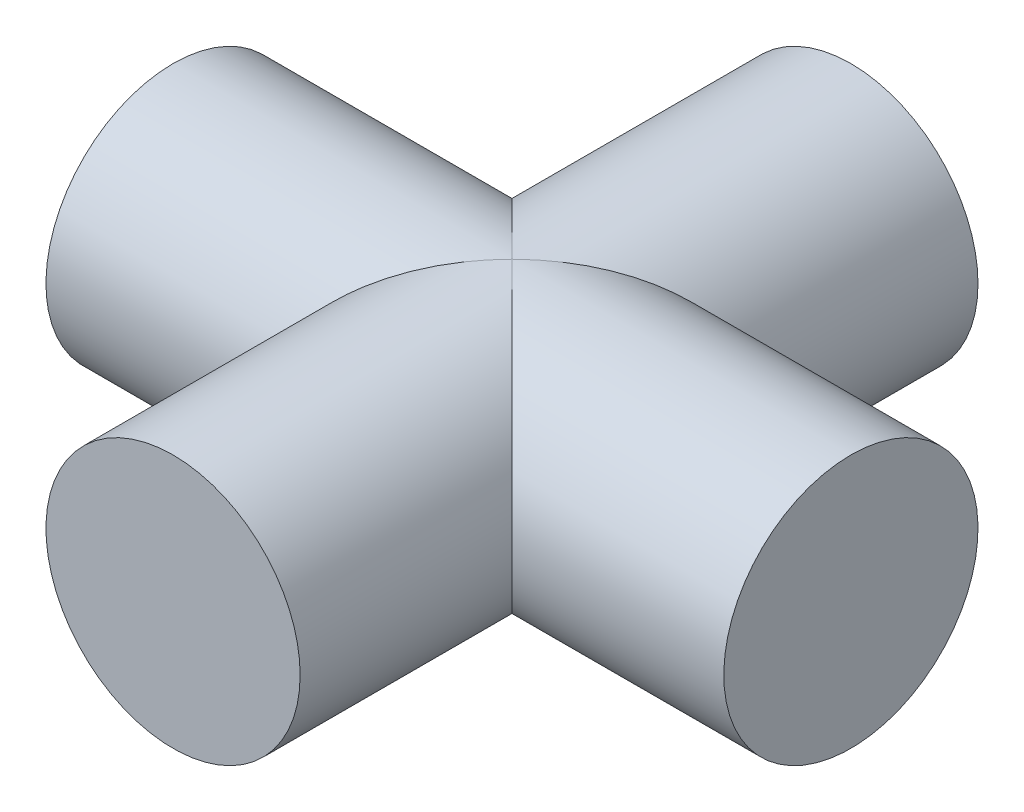
ISO-10303-21;
HEADER;
FILE_DESCRIPTION(('STEP AP214'),'2;1');
FILE_NAME('part.step','',(''),(''),'','','');
FILE_SCHEMA(('AUTOMOTIVE_DESIGN { 1 0 10303 214 1 1 1 1 }'));
ENDSEC;
DATA;
#1=APPLICATION_CONTEXT('core data for automotive mechanical design processes');
#2=APPLICATION_PROTOCOL_DEFINITION('international standard','automotive_design',2000,#1);
#3=PRODUCT_CONTEXT('',#1,'mechanical');
#4=PRODUCT('Part','Part','',(#3));
#5=PRODUCT_RELATED_PRODUCT_CATEGORY('part','',(#4));
#6=PRODUCT_DEFINITION_FORMATION('','',#4);
#7=PRODUCT_DEFINITION_CONTEXT('part definition',#1,'design');
#8=PRODUCT_DEFINITION('design','',#6,#7);
#9=PRODUCT_DEFINITION_SHAPE('','',#8);
#10=(LENGTH_UNIT() NAMED_UNIT(*) SI_UNIT(.MILLI.,.METRE.));
#11=(NAMED_UNIT(*) PLANE_ANGLE_UNIT() SI_UNIT($,.RADIAN.));
#12=(NAMED_UNIT(*) SI_UNIT($,.STERADIAN.) SOLID_ANGLE_UNIT());
#13=UNCERTAINTY_MEASURE_WITH_UNIT(LENGTH_MEASURE(1.E-05),#10,'distance_accuracy_value','');
#14=(GEOMETRIC_REPRESENTATION_CONTEXT(3) GLOBAL_UNCERTAINTY_ASSIGNED_CONTEXT((#13)) GLOBAL_UNIT_ASSIGNED_CONTEXT((#10,
#11,#12)) REPRESENTATION_CONTEXT('',''));
#15=CARTESIAN_POINT('',(0.,0.,0.));
#16=DIRECTION('',(0.,0.,1.));
#17=DIRECTION('',(1.,0.,0.));
#18=AXIS2_PLACEMENT_3D('',#15,#16,#17);
#19=CARTESIAN_POINT('',(40.,0.,0.));
#20=DIRECTION('',(-1.,0.,0.));
#21=DIRECTION('',(0.,0.,1.));
#22=AXIS2_PLACEMENT_3D('',#19,#20,#21);
#23=CYLINDRICAL_SURFACE('',#22,7.5);
#24=CARTESIAN_POINT('',(40.,0.,0.));
#25=DIRECTION('',(1.,0.,0.));
#26=DIRECTION('',(0.,1.,0.));
#27=AXIS2_PLACEMENT_3D('',#24,#25,#26);
#28=CIRCLE('',#27,7.5);
#29=CARTESIAN_POINT('',(40.,7.5,0.));
#30=VERTEX_POINT('',#29);
#31=EDGE_CURVE('E47',#30,#30,#28,.T.);
#32=ORIENTED_EDGE('',*,*,#31,.F.);
#33=EDGE_LOOP('',(#32));
#34=FACE_BOUND('',#33,.T.);
#35=CARTESIAN_POINT('',(20.,0.,0.));
#36=DIRECTION('',(-0.707106781186548,0.,-0.707106781186548));
#37=DIRECTION('',(-0.707106781186548,0.,0.707106781186548));
#38=AXIS2_PLACEMENT_3D('',#35,#36,#37);
#39=ELLIPSE('',#38,10.6066017177982,7.5);
#40=CARTESIAN_POINT('',(20.,7.5,0.));
#41=VERTEX_POINT('',#40);
#42=CARTESIAN_POINT('',(20.,-7.5,0.));
#43=VERTEX_POINT('',#42);
#44=EDGE_CURVE('E26',#41,#43,#39,.T.);
#45=ORIENTED_EDGE('',*,*,#44,.F.);
#46=CARTESIAN_POINT('',(20.,0.,0.));
#47=DIRECTION('',(-0.707106781186548,0.,0.707106781186548));
#48=DIRECTION('',(-0.707106781186548,0.,-0.707106781186548));
#49=AXIS2_PLACEMENT_3D('',#46,#47,#48);
#50=ELLIPSE('',#49,10.6066017177982,7.5);
#51=EDGE_CURVE('E41',#43,#41,#50,.T.);
#52=ORIENTED_EDGE('',*,*,#51,.F.);
#53=EDGE_LOOP('',(#45,#52));
#54=FACE_BOUND('',#53,.T.);
#55=ADVANCED_FACE('F17',(#34,#54),#23,.T.);
#56=CARTESIAN_POINT('',(40.,0.,0.));
#57=DIRECTION('',(1.,0.,0.));
#58=DIRECTION('',(0.,0.,-1.));
#59=AXIS2_PLACEMENT_3D('',#56,#57,#58);
#60=PLANE('',#59);
#61=ORIENTED_EDGE('',*,*,#31,.T.);
#62=EDGE_LOOP('',(#61));
#63=FACE_BOUND('',#62,.T.);
#64=ADVANCED_FACE('F73',(#63),#60,.T.);
#65=CARTESIAN_POINT('',(20.,0.,-20.));
#66=DIRECTION('',(0.,0.,1.));
#67=DIRECTION('',(1.,0.,0.));
#68=AXIS2_PLACEMENT_3D('',#65,#66,#67);
#69=PLANE('',#68);
#70=CARTESIAN_POINT('',(20.,0.,-20.));
#71=DIRECTION('',(0.,0.,1.));
#72=DIRECTION('',(1.,0.,0.));
#73=AXIS2_PLACEMENT_3D('',#70,#71,#72);
#74=CIRCLE('',#73,7.5);
#75=CARTESIAN_POINT('',(27.5,0.,-20.));
#76=VERTEX_POINT('',#75);
#77=EDGE_CURVE('E92',#76,#76,#74,.T.);
#78=ORIENTED_EDGE('',*,*,#77,.F.);
#79=EDGE_LOOP('',(#78));
#80=FACE_BOUND('',#79,.T.);
#81=ADVANCED_FACE('F70',(#80),#69,.F.);
#82=CARTESIAN_POINT('',(20.,0.,20.));
#83=DIRECTION('',(0.,0.,-1.));
#84=DIRECTION('',(-1.,0.,0.));
#85=AXIS2_PLACEMENT_3D('',#82,#83,#84);
#86=CYLINDRICAL_SURFACE('',#85,7.5);
#87=ORIENTED_EDGE('',*,*,#77,.T.);
#88=EDGE_LOOP('',(#87));
#89=FACE_BOUND('',#88,.T.);
#90=CARTESIAN_POINT('',(20.,0.,0.));
#91=DIRECTION('',(-0.707106781186548,0.,0.707106781186548));
#92=DIRECTION('',(-0.707106781186548,0.,-0.707106781186548));
#93=AXIS2_PLACEMENT_3D('',#90,#91,#92);
#94=ELLIPSE('',#93,10.6066017177982,7.5);
#95=EDGE_CURVE('E35',#43,#41,#94,.F.);
#96=ORIENTED_EDGE('',*,*,#95,.T.);
#97=ORIENTED_EDGE('',*,*,#44,.T.);
#98=EDGE_LOOP('',(#96,#97));
#99=FACE_BOUND('',#98,.T.);
#100=ADVANCED_FACE('F49',(#89,#99),#86,.T.);
#101=CARTESIAN_POINT('',(0.,0.,0.));
#102=DIRECTION('',(1.,0.,0.));
#103=DIRECTION('',(0.,0.,-1.));
#104=AXIS2_PLACEMENT_3D('',#101,#102,#103);
#105=PLANE('',#104);
#106=CARTESIAN_POINT('',(0.,0.,0.));
#107=DIRECTION('',(1.,0.,0.));
#108=DIRECTION('',(0.,1.,0.));
#109=AXIS2_PLACEMENT_3D('',#106,#107,#108);
#110=CIRCLE('',#109,7.5);
#111=CARTESIAN_POINT('',(0.,7.5,0.));
#112=VERTEX_POINT('',#111);
#113=EDGE_CURVE('E82',#112,#112,#110,.T.);
#114=ORIENTED_EDGE('',*,*,#113,.F.);
#115=EDGE_LOOP('',(#114));
#116=FACE_BOUND('',#115,.T.);
#117=ADVANCED_FACE('F64',(#116),#105,.F.);
#118=ORIENTED_EDGE('',*,*,#113,.T.);
#119=EDGE_LOOP('',(#118));
#120=FACE_BOUND('',#119,.T.);
#121=CARTESIAN_POINT('',(20.,0.,0.));
#122=DIRECTION('',(-0.707106781186548,0.,-0.707106781186548));
#123=DIRECTION('',(-0.707106781186548,0.,0.707106781186548));
#124=AXIS2_PLACEMENT_3D('',#121,#122,#123);
#125=ELLIPSE('',#124,10.6066017177982,7.5);
#126=EDGE_CURVE('E11',#41,#43,#125,.F.);
#127=ORIENTED_EDGE('',*,*,#126,.F.);
#128=ORIENTED_EDGE('',*,*,#95,.F.);
#129=EDGE_LOOP('',(#127,#128));
#130=FACE_BOUND('',#129,.T.);
#131=ADVANCED_FACE('F19',(#120,#130),#23,.T.);
#132=CARTESIAN_POINT('',(20.,0.,20.));
#133=DIRECTION('',(0.,0.,1.));
#134=DIRECTION('',(1.,0.,0.));
#135=AXIS2_PLACEMENT_3D('',#132,#133,#134);
#136=CIRCLE('',#135,7.5);
#137=CARTESIAN_POINT('',(27.5,0.,20.));
#138=VERTEX_POINT('',#137);
#139=EDGE_CURVE('E89',#138,#138,#136,.T.);
#140=ORIENTED_EDGE('',*,*,#139,.F.);
#141=EDGE_LOOP('',(#140));
#142=FACE_BOUND('',#141,.T.);
#143=ORIENTED_EDGE('',*,*,#51,.T.);
#144=ORIENTED_EDGE('',*,*,#126,.T.);
#145=EDGE_LOOP('',(#143,#144));
#146=FACE_BOUND('',#145,.T.);
#147=ADVANCED_FACE('F51',(#142,#146),#86,.T.);
#148=CARTESIAN_POINT('',(20.,0.,20.));
#149=DIRECTION('',(0.,0.,1.));
#150=DIRECTION('',(1.,0.,0.));
#151=AXIS2_PLACEMENT_3D('',#148,#149,#150);
#152=PLANE('',#151);
#153=ORIENTED_EDGE('',*,*,#139,.T.);
#154=EDGE_LOOP('',(#153));
#155=FACE_BOUND('',#154,.T.);
#156=ADVANCED_FACE('F53',(#155),#152,.T.);
#157=CLOSED_SHELL('',(#55,#64,#81,#100,#117,#131,#147,#156));
#158=MANIFOLD_SOLID_BREP('B1',#157);
#159=ADVANCED_BREP_SHAPE_REPRESENTATION('',(#18,#158),#14);
#160=SHAPE_DEFINITION_REPRESENTATION(#9,#159);
ENDSEC;
END-ISO-10303-21;
